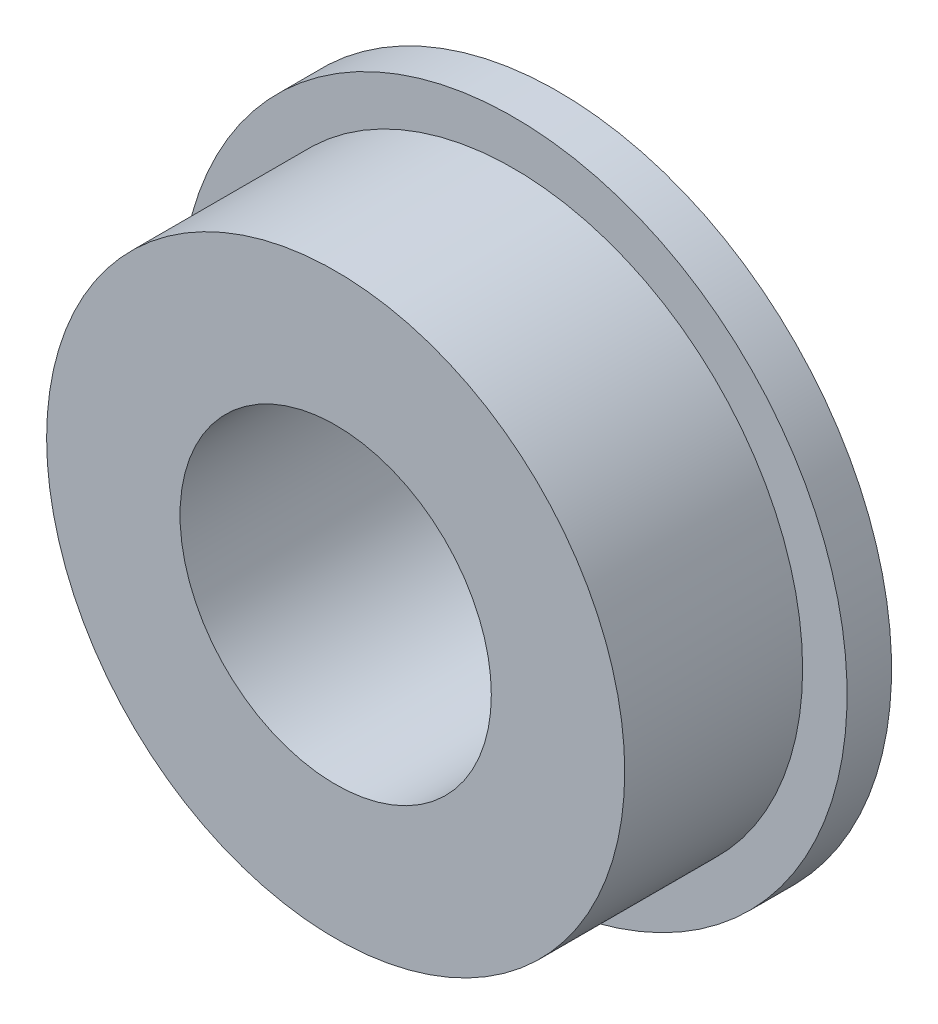
ISO-10303-21;
HEADER;
FILE_DESCRIPTION(('STEP AP214'),'2;1');
FILE_NAME('part.step','',(''),(''),'','','');
FILE_SCHEMA(('AUTOMOTIVE_DESIGN { 1 0 10303 214 1 1 1 1 }'));
ENDSEC;
DATA;
#1=APPLICATION_CONTEXT('core data for automotive mechanical design processes');
#2=APPLICATION_PROTOCOL_DEFINITION('international standard','automotive_design',2000,#1);
#3=PRODUCT_CONTEXT('',#1,'mechanical');
#4=PRODUCT('Part','Part','',(#3));
#5=PRODUCT_RELATED_PRODUCT_CATEGORY('part','',(#4));
#6=PRODUCT_DEFINITION_FORMATION('','',#4);
#7=PRODUCT_DEFINITION_CONTEXT('part definition',#1,'design');
#8=PRODUCT_DEFINITION('design','',#6,#7);
#9=PRODUCT_DEFINITION_SHAPE('','',#8);
#10=(LENGTH_UNIT() NAMED_UNIT(*) SI_UNIT(.MILLI.,.METRE.));
#11=(NAMED_UNIT(*) PLANE_ANGLE_UNIT() SI_UNIT($,.RADIAN.));
#12=(NAMED_UNIT(*) SI_UNIT($,.STERADIAN.) SOLID_ANGLE_UNIT());
#13=UNCERTAINTY_MEASURE_WITH_UNIT(LENGTH_MEASURE(1.E-05),#10,'distance_accuracy_value','');
#14=(GEOMETRIC_REPRESENTATION_CONTEXT(3) GLOBAL_UNCERTAINTY_ASSIGNED_CONTEXT((#13)) GLOBAL_UNIT_ASSIGNED_CONTEXT((#10,
#11,#12)) REPRESENTATION_CONTEXT('',''));
#15=CARTESIAN_POINT('',(0.,0.,0.));
#16=DIRECTION('',(0.,0.,1.));
#17=DIRECTION('',(1.,0.,0.));
#18=AXIS2_PLACEMENT_3D('',#15,#16,#17);
#19=CARTESIAN_POINT('',(0.,0.,5.));
#20=DIRECTION('',(0.,0.,-1.));
#21=DIRECTION('',(-1.,0.,0.));
#22=AXIS2_PLACEMENT_3D('',#19,#20,#21);
#23=CYLINDRICAL_SURFACE('',#22,6.5);
#24=CARTESIAN_POINT('',(0.,0.,5.));
#25=DIRECTION('',(0.,0.,1.));
#26=DIRECTION('',(1.,0.,0.));
#27=AXIS2_PLACEMENT_3D('',#24,#25,#26);
#28=CIRCLE('',#27,6.5);
#29=CARTESIAN_POINT('',(6.5,0.,5.));
#30=VERTEX_POINT('',#29);
#31=EDGE_CURVE('E44',#30,#30,#28,.T.);
#32=ORIENTED_EDGE('',*,*,#31,.F.);
#33=EDGE_LOOP('',(#32));
#34=FACE_BOUND('',#33,.T.);
#35=CARTESIAN_POINT('',(0.,0.,1.));
#36=DIRECTION('',(0.,0.,-1.));
#37=DIRECTION('',(-1.,0.,0.));
#38=AXIS2_PLACEMENT_3D('',#35,#36,#37);
#39=CIRCLE('',#38,6.5);
#40=CARTESIAN_POINT('',(-6.5,0.,1.));
#41=VERTEX_POINT('',#40);
#42=EDGE_CURVE('E10',#41,#41,#39,.T.);
#43=ORIENTED_EDGE('',*,*,#42,.F.);
#44=EDGE_LOOP('',(#43));
#45=FACE_BOUND('',#44,.T.);
#46=ADVANCED_FACE('F37',(#34,#45),#23,.T.);
#47=CARTESIAN_POINT('',(0.,0.,5.));
#48=DIRECTION('',(0.,0.,1.));
#49=DIRECTION('',(1.,0.,0.));
#50=AXIS2_PLACEMENT_3D('',#47,#48,#49);
#51=PLANE('',#50);
#52=CARTESIAN_POINT('',(0.,0.,5.));
#53=DIRECTION('',(0.,0.,1.));
#54=DIRECTION('',(1.,0.,0.));
#55=AXIS2_PLACEMENT_3D('',#52,#53,#54);
#56=CIRCLE('',#55,3.5);
#57=CARTESIAN_POINT('',(3.5,0.,5.));
#58=VERTEX_POINT('',#57);
#59=EDGE_CURVE('E61',#58,#58,#56,.T.);
#60=ORIENTED_EDGE('',*,*,#59,.F.);
#61=EDGE_LOOP('',(#60));
#62=FACE_BOUND('',#61,.T.);
#63=ORIENTED_EDGE('',*,*,#31,.T.);
#64=EDGE_LOOP('',(#63));
#65=FACE_BOUND('',#64,.T.);
#66=ADVANCED_FACE('F78',(#62,#65),#51,.T.);
#67=CARTESIAN_POINT('',(0.,0.,1.));
#68=DIRECTION('',(0.,0.,-1.));
#69=DIRECTION('',(-1.,0.,0.));
#70=AXIS2_PLACEMENT_3D('',#67,#68,#69);
#71=CYLINDRICAL_SURFACE('',#70,7.5);
#72=CARTESIAN_POINT('',(0.,0.,1.));
#73=DIRECTION('',(0.,0.,-1.));
#74=DIRECTION('',(-1.,0.,0.));
#75=AXIS2_PLACEMENT_3D('',#72,#73,#74);
#76=CIRCLE('',#75,7.5);
#77=CARTESIAN_POINT('',(-7.5,0.,1.));
#78=VERTEX_POINT('',#77);
#79=EDGE_CURVE('E49',#78,#78,#76,.T.);
#80=ORIENTED_EDGE('',*,*,#79,.T.);
#81=EDGE_LOOP('',(#80));
#82=FACE_BOUND('',#81,.T.);
#83=CARTESIAN_POINT('',(0.,0.,0.));
#84=DIRECTION('',(0.,0.,-1.));
#85=DIRECTION('',(-1.,0.,0.));
#86=AXIS2_PLACEMENT_3D('',#83,#84,#85);
#87=CIRCLE('',#86,7.5);
#88=CARTESIAN_POINT('',(-7.5,0.,0.));
#89=VERTEX_POINT('',#88);
#90=EDGE_CURVE('E54',#89,#89,#87,.T.);
#91=ORIENTED_EDGE('',*,*,#90,.F.);
#92=EDGE_LOOP('',(#91));
#93=FACE_BOUND('',#92,.T.);
#94=ADVANCED_FACE('F80',(#82,#93),#71,.T.);
#95=CARTESIAN_POINT('',(0.,0.,1.));
#96=DIRECTION('',(0.,0.,-1.));
#97=DIRECTION('',(-1.,0.,0.));
#98=AXIS2_PLACEMENT_3D('',#95,#96,#97);
#99=PLANE('',#98);
#100=ORIENTED_EDGE('',*,*,#42,.T.);
#101=EDGE_LOOP('',(#100));
#102=FACE_BOUND('',#101,.T.);
#103=ORIENTED_EDGE('',*,*,#79,.F.);
#104=EDGE_LOOP('',(#103));
#105=FACE_BOUND('',#104,.T.);
#106=ADVANCED_FACE('F86',(#102,#105),#99,.F.);
#107=CARTESIAN_POINT('',(0.,0.,0.));
#108=DIRECTION('',(0.,0.,1.));
#109=DIRECTION('',(1.,0.,0.));
#110=AXIS2_PLACEMENT_3D('',#107,#108,#109);
#111=PLANE('',#110);
#112=CARTESIAN_POINT('',(0.,0.,0.));
#113=DIRECTION('',(0.,0.,1.));
#114=DIRECTION('',(1.,0.,0.));
#115=AXIS2_PLACEMENT_3D('',#112,#113,#114);
#116=CIRCLE('',#115,3.5);
#117=CARTESIAN_POINT('',(3.5,0.,0.));
#118=VERTEX_POINT('',#117);
#119=EDGE_CURVE('E59',#118,#118,#116,.T.);
#120=ORIENTED_EDGE('',*,*,#119,.T.);
#121=EDGE_LOOP('',(#120));
#122=FACE_BOUND('',#121,.T.);
#123=ORIENTED_EDGE('',*,*,#90,.T.);
#124=EDGE_LOOP('',(#123));
#125=FACE_BOUND('',#124,.T.);
#126=ADVANCED_FACE('F69',(#122,#125),#111,.F.);
#127=CARTESIAN_POINT('',(0.,0.,0.));
#128=DIRECTION('',(0.,0.,1.));
#129=DIRECTION('',(1.,0.,0.));
#130=AXIS2_PLACEMENT_3D('',#127,#128,#129);
#131=CYLINDRICAL_SURFACE('',#130,3.5);
#132=ORIENTED_EDGE('',*,*,#119,.F.);
#133=EDGE_LOOP('',(#132));
#134=FACE_BOUND('',#133,.T.);
#135=ORIENTED_EDGE('',*,*,#59,.T.);
#136=EDGE_LOOP('',(#135));
#137=FACE_BOUND('',#136,.T.);
#138=ADVANCED_FACE('F72',(#134,#137),#131,.F.);
#139=CLOSED_SHELL('',(#46,#66,#94,#106,#126,#138));
#140=MANIFOLD_SOLID_BREP('B2',#139);
#141=ADVANCED_BREP_SHAPE_REPRESENTATION('',(#18,#140),#14);
#142=SHAPE_DEFINITION_REPRESENTATION(#9,#141);
ENDSEC;
END-ISO-10303-21;
